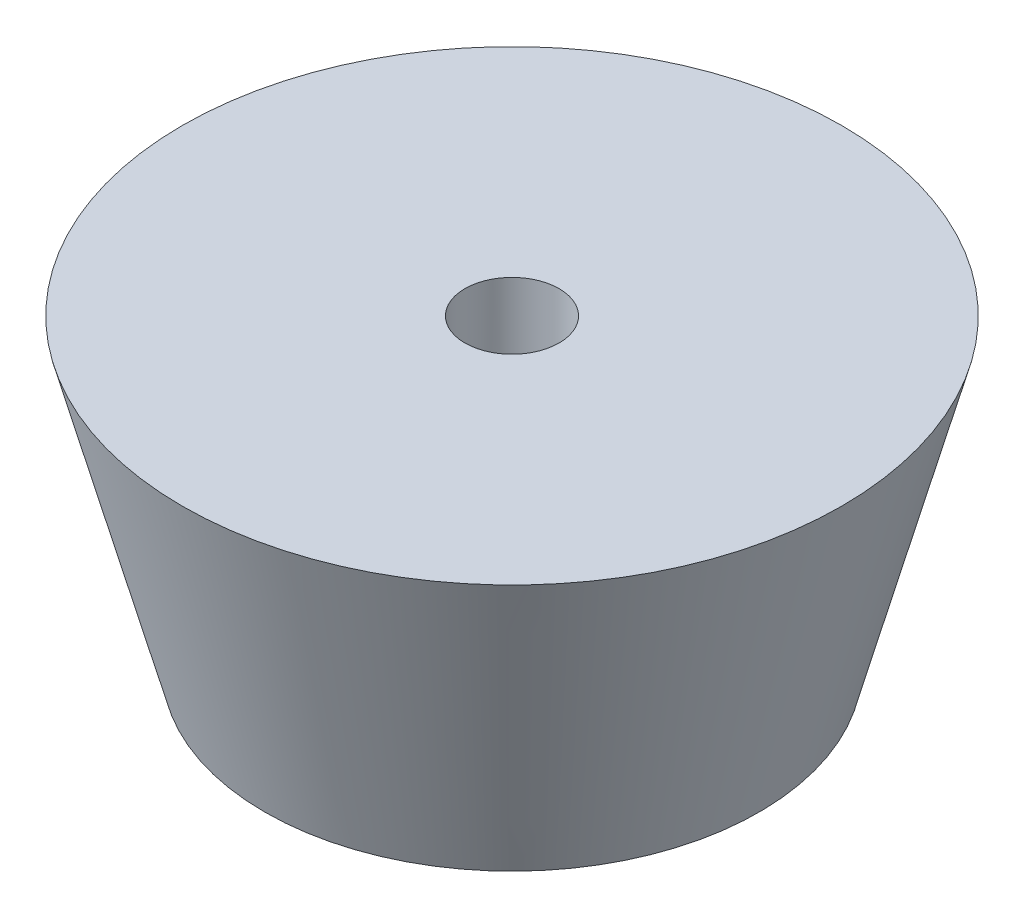
ISO-10303-21;
HEADER;
FILE_DESCRIPTION(('STEP AP214'),'2;1');
FILE_NAME('part.step','',(''),(''),'','','');
FILE_SCHEMA(('AUTOMOTIVE_DESIGN { 1 0 10303 214 1 1 1 1 }'));
ENDSEC;
DATA;
#1=APPLICATION_CONTEXT('core data for automotive mechanical design processes');
#2=APPLICATION_PROTOCOL_DEFINITION('international standard','automotive_design',2000,#1);
#3=PRODUCT_CONTEXT('',#1,'mechanical');
#4=PRODUCT('Part','Part','',(#3));
#5=PRODUCT_RELATED_PRODUCT_CATEGORY('part','',(#4));
#6=PRODUCT_DEFINITION_FORMATION('','',#4);
#7=PRODUCT_DEFINITION_CONTEXT('part definition',#1,'design');
#8=PRODUCT_DEFINITION('design','',#6,#7);
#9=PRODUCT_DEFINITION_SHAPE('','',#8);
#10=(LENGTH_UNIT() NAMED_UNIT(*) SI_UNIT(.MILLI.,.METRE.));
#11=(NAMED_UNIT(*) PLANE_ANGLE_UNIT() SI_UNIT($,.RADIAN.));
#12=(NAMED_UNIT(*) SI_UNIT($,.STERADIAN.) SOLID_ANGLE_UNIT());
#13=UNCERTAINTY_MEASURE_WITH_UNIT(LENGTH_MEASURE(1.E-05),#10,'distance_accuracy_value','');
#14=(GEOMETRIC_REPRESENTATION_CONTEXT(3) GLOBAL_UNCERTAINTY_ASSIGNED_CONTEXT((#13)) GLOBAL_UNIT_ASSIGNED_CONTEXT((#10,
#11,#12)) REPRESENTATION_CONTEXT('',''));
#15=CARTESIAN_POINT('',(0.,0.,0.));
#16=DIRECTION('',(0.,0.,1.));
#17=DIRECTION('',(1.,0.,0.));
#18=AXIS2_PLACEMENT_3D('',#15,#16,#17);
#19=CARTESIAN_POINT('',(0.,0.,0.));
#20=DIRECTION('',(0.,1.,0.));
#21=DIRECTION('',(0.,0.,1.));
#22=AXIS2_PLACEMENT_3D('',#19,#20,#21);
#23=PLANE('',#22);
#24=CARTESIAN_POINT('',(0.,0.,0.));
#25=DIRECTION('',(0.,-1.,0.));
#26=DIRECTION('',(0.,0.,-1.));
#27=AXIS2_PLACEMENT_3D('',#24,#25,#26);
#28=CIRCLE('',#27,6.5);
#29=CARTESIAN_POINT('',(0.,0.,-6.5));
#30=VERTEX_POINT('',#29);
#31=EDGE_CURVE('E104',#30,#30,#28,.T.);
#32=ORIENTED_EDGE('',*,*,#31,.F.);
#33=EDGE_LOOP('',(#32));
#34=FACE_BOUND('',#33,.T.);
#35=CARTESIAN_POINT('',(0.,0.,0.));
#36=DIRECTION('',(0.,1.,0.));
#37=DIRECTION('',(0.,0.,1.));
#38=AXIS2_PLACEMENT_3D('',#35,#36,#37);
#39=CIRCLE('',#38,10.5);
#40=CARTESIAN_POINT('',(0.,0.,10.5));
#41=VERTEX_POINT('',#40);
#42=EDGE_CURVE('E11',#41,#41,#39,.T.);
#43=ORIENTED_EDGE('',*,*,#42,.F.);
#44=EDGE_LOOP('',(#43));
#45=FACE_BOUND('',#44,.T.);
#46=ADVANCED_FACE('F34',(#34,#45),#23,.F.);
#47=CARTESIAN_POINT('',(0.,13.,0.));
#48=DIRECTION('',(0.,1.,0.));
#49=DIRECTION('',(0.,0.,1.));
#50=AXIS2_PLACEMENT_3D('',#47,#48,#49);
#51=PLANE('',#50);
#52=CARTESIAN_POINT('',(0.,13.,0.));
#53=DIRECTION('',(0.,1.,0.));
#54=DIRECTION('',(0.,0.,1.));
#55=AXIS2_PLACEMENT_3D('',#52,#53,#54);
#56=CIRCLE('',#55,2.);
#57=CARTESIAN_POINT('',(0.,13.,2.));
#58=VERTEX_POINT('',#57);
#59=EDGE_CURVE('E38',#58,#58,#56,.T.);
#60=ORIENTED_EDGE('',*,*,#59,.F.);
#61=EDGE_LOOP('',(#60));
#62=FACE_BOUND('',#61,.T.);
#63=CARTESIAN_POINT('',(0.,13.,0.));
#64=DIRECTION('',(0.,1.,0.));
#65=DIRECTION('',(0.,0.,1.));
#66=AXIS2_PLACEMENT_3D('',#63,#64,#65);
#67=CIRCLE('',#66,14.);
#68=CARTESIAN_POINT('',(0.,13.,14.));
#69=VERTEX_POINT('',#68);
#70=EDGE_CURVE('E42',#69,#69,#67,.T.);
#71=ORIENTED_EDGE('',*,*,#70,.T.);
#72=EDGE_LOOP('',(#71));
#73=FACE_BOUND('',#72,.T.);
#74=ADVANCED_FACE('F69',(#62,#73),#51,.T.);
#75=CARTESIAN_POINT('',(0.,0.,0.));
#76=DIRECTION('',(0.,1.,0.));
#77=DIRECTION('',(0.,0.,1.));
#78=AXIS2_PLACEMENT_3D('',#75,#76,#77);
#79=CONICAL_SURFACE('',#78,10.5,0.262994731680919);
#80=ORIENTED_EDGE('',*,*,#70,.F.);
#81=EDGE_LOOP('',(#80));
#82=FACE_BOUND('',#81,.T.);
#83=ORIENTED_EDGE('',*,*,#42,.T.);
#84=EDGE_LOOP('',(#83));
#85=FACE_BOUND('',#84,.T.);
#86=ADVANCED_FACE('F78',(#82,#85),#79,.T.);
#87=CARTESIAN_POINT('',(0.,10.,0.));
#88=DIRECTION('',(0.,-1.,0.));
#89=DIRECTION('',(0.,0.,-1.));
#90=AXIS2_PLACEMENT_3D('',#87,#88,#89);
#91=CYLINDRICAL_SURFACE('',#90,6.5);
#92=CARTESIAN_POINT('',(0.,10.,0.));
#93=DIRECTION('',(0.,-1.,0.));
#94=DIRECTION('',(0.,0.,-1.));
#95=AXIS2_PLACEMENT_3D('',#92,#93,#94);
#96=CIRCLE('',#95,6.5);
#97=CARTESIAN_POINT('',(0.,10.,-6.5));
#98=VERTEX_POINT('',#97);
#99=EDGE_CURVE('E48',#98,#98,#96,.T.);
#100=ORIENTED_EDGE('',*,*,#99,.F.);
#101=EDGE_LOOP('',(#100));
#102=FACE_BOUND('',#101,.T.);
#103=ORIENTED_EDGE('',*,*,#31,.T.);
#104=EDGE_LOOP('',(#103));
#105=FACE_BOUND('',#104,.T.);
#106=ADVANCED_FACE('F80',(#102,#105),#91,.F.);
#107=CARTESIAN_POINT('',(0.,10.,0.));
#108=DIRECTION('',(0.,-1.,0.));
#109=DIRECTION('',(0.,0.,-1.));
#110=AXIS2_PLACEMENT_3D('',#107,#108,#109);
#111=PLANE('',#110);
#112=CARTESIAN_POINT('',(0.,10.,0.));
#113=DIRECTION('',(0.,-1.,0.));
#114=DIRECTION('',(0.,0.,-1.));
#115=AXIS2_PLACEMENT_3D('',#112,#113,#114);
#116=CIRCLE('',#115,2.);
#117=CARTESIAN_POINT('',(0.,10.,-2.));
#118=VERTEX_POINT('',#117);
#119=EDGE_CURVE('E109',#118,#118,#116,.T.);
#120=ORIENTED_EDGE('',*,*,#119,.F.);
#121=EDGE_LOOP('',(#120));
#122=FACE_BOUND('',#121,.T.);
#123=ORIENTED_EDGE('',*,*,#99,.T.);
#124=EDGE_LOOP('',(#123));
#125=FACE_BOUND('',#124,.T.);
#126=ADVANCED_FACE('F119',(#122,#125),#111,.T.);
#127=CARTESIAN_POINT('',(0.,13.0001,0.));
#128=DIRECTION('',(0.,-1.,0.));
#129=DIRECTION('',(0.,0.,-1.));
#130=AXIS2_PLACEMENT_3D('',#127,#128,#129);
#131=CYLINDRICAL_SURFACE('',#130,2.);
#132=ORIENTED_EDGE('',*,*,#59,.T.);
#133=EDGE_LOOP('',(#132));
#134=FACE_BOUND('',#133,.T.);
#135=ORIENTED_EDGE('',*,*,#119,.T.);
#136=EDGE_LOOP('',(#135));
#137=FACE_BOUND('',#136,.T.);
#138=ADVANCED_FACE('F116',(#134,#137),#131,.F.);
#139=CLOSED_SHELL('',(#46,#74,#86,#106,#126,#138));
#140=MANIFOLD_SOLID_BREP('B2',#139);
#141=ADVANCED_BREP_SHAPE_REPRESENTATION('',(#18,#140),#14);
#142=SHAPE_DEFINITION_REPRESENTATION(#9,#141);
ENDSEC;
END-ISO-10303-21;
